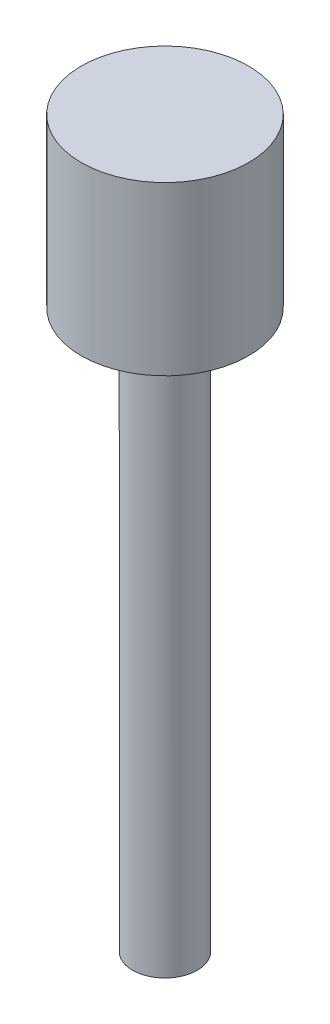
ISO-10303-21;
HEADER;
FILE_DESCRIPTION(('STEP AP214'),'2;1');
FILE_NAME('part.step','',(''),(''),'','','');
FILE_SCHEMA(('AUTOMOTIVE_DESIGN { 1 0 10303 214 1 1 1 1 }'));
ENDSEC;
DATA;
#1=APPLICATION_CONTEXT('core data for automotive mechanical design processes');
#2=APPLICATION_PROTOCOL_DEFINITION('international standard','automotive_design',2000,#1);
#3=PRODUCT_CONTEXT('',#1,'mechanical');
#4=PRODUCT('Part','Part','',(#3));
#5=PRODUCT_RELATED_PRODUCT_CATEGORY('part','',(#4));
#6=PRODUCT_DEFINITION_FORMATION('','',#4);
#7=PRODUCT_DEFINITION_CONTEXT('part definition',#1,'design');
#8=PRODUCT_DEFINITION('design','',#6,#7);
#9=PRODUCT_DEFINITION_SHAPE('','',#8);
#10=(LENGTH_UNIT() NAMED_UNIT(*) SI_UNIT(.MILLI.,.METRE.));
#11=(NAMED_UNIT(*) PLANE_ANGLE_UNIT() SI_UNIT($,.RADIAN.));
#12=(NAMED_UNIT(*) SI_UNIT($,.STERADIAN.) SOLID_ANGLE_UNIT());
#13=UNCERTAINTY_MEASURE_WITH_UNIT(LENGTH_MEASURE(1.E-05),#10,'distance_accuracy_value','');
#14=(GEOMETRIC_REPRESENTATION_CONTEXT(3) GLOBAL_UNCERTAINTY_ASSIGNED_CONTEXT((#13)) GLOBAL_UNIT_ASSIGNED_CONTEXT((#10,
#11,#12)) REPRESENTATION_CONTEXT('',''));
#15=CARTESIAN_POINT('',(0.,0.,0.));
#16=DIRECTION('',(0.,0.,1.));
#17=DIRECTION('',(1.,0.,0.));
#18=AXIS2_PLACEMENT_3D('',#15,#16,#17);
#19=CARTESIAN_POINT('',(0.,-65.,0.));
#20=DIRECTION('',(0.,-1.,0.));
#21=DIRECTION('',(0.,0.,-1.));
#22=AXIS2_PLACEMENT_3D('',#19,#20,#21);
#23=PLANE('',#22);
#24=CARTESIAN_POINT('',(0.,-65.,0.));
#25=DIRECTION('',(0.,-1.,0.));
#26=DIRECTION('',(0.,0.,-1.));
#27=AXIS2_PLACEMENT_3D('',#24,#25,#26);
#28=CIRCLE('',#27,2.9);
#29=CARTESIAN_POINT('',(0.,-65.,-2.9));
#30=VERTEX_POINT('',#29);
#31=EDGE_CURVE('E46',#30,#30,#28,.T.);
#32=ORIENTED_EDGE('',*,*,#31,.T.);
#33=EDGE_LOOP('',(#32));
#34=FACE_BOUND('',#33,.T.);
#35=CARTESIAN_POINT('',(0.,-65.,0.));
#36=DIRECTION('',(0.,1.,0.));
#37=DIRECTION('',(0.,0.,1.));
#38=AXIS2_PLACEMENT_3D('',#35,#36,#37);
#39=CIRCLE('',#38,1.65);
#40=CARTESIAN_POINT('',(0.,-65.,1.65));
#41=VERTEX_POINT('',#40);
#42=EDGE_CURVE('E51',#41,#41,#39,.T.);
#43=ORIENTED_EDGE('',*,*,#42,.T.);
#44=EDGE_LOOP('',(#43));
#45=FACE_BOUND('',#44,.T.);
#46=ADVANCED_FACE('F30',(#34,#45),#23,.T.);
#47=CARTESIAN_POINT('',(0.,-15.,0.));
#48=DIRECTION('',(0.,1.,0.));
#49=DIRECTION('',(0.,0.,1.));
#50=AXIS2_PLACEMENT_3D('',#47,#48,#49);
#51=PLANE('',#50);
#52=CARTESIAN_POINT('',(0.,-15.,0.));
#53=DIRECTION('',(0.,1.,0.));
#54=DIRECTION('',(0.,0.,1.));
#55=AXIS2_PLACEMENT_3D('',#52,#53,#54);
#56=CIRCLE('',#55,7.5);
#57=CARTESIAN_POINT('',(0.,-15.,7.5));
#58=VERTEX_POINT('',#57);
#59=EDGE_CURVE('E37',#58,#58,#56,.T.);
#60=ORIENTED_EDGE('',*,*,#59,.F.);
#61=EDGE_LOOP('',(#60));
#62=FACE_BOUND('',#61,.T.);
#63=CARTESIAN_POINT('',(0.,-15.,0.));
#64=DIRECTION('',(0.,1.,0.));
#65=DIRECTION('',(0.,0.,1.));
#66=AXIS2_PLACEMENT_3D('',#63,#64,#65);
#67=CIRCLE('',#66,2.9);
#68=CARTESIAN_POINT('',(0.,-15.,2.9));
#69=VERTEX_POINT('',#68);
#70=EDGE_CURVE('E10',#69,#69,#67,.F.);
#71=ORIENTED_EDGE('',*,*,#70,.F.);
#72=EDGE_LOOP('',(#71));
#73=FACE_BOUND('',#72,.T.);
#74=ADVANCED_FACE('F69',(#62,#73),#51,.F.);
#75=CARTESIAN_POINT('',(0.,-15.,0.));
#76=DIRECTION('',(0.,1.,0.));
#77=DIRECTION('',(0.,0.,1.));
#78=AXIS2_PLACEMENT_3D('',#75,#76,#77);
#79=CYLINDRICAL_SURFACE('',#78,7.5);
#80=ORIENTED_EDGE('',*,*,#59,.T.);
#81=EDGE_LOOP('',(#80));
#82=FACE_BOUND('',#81,.T.);
#83=CARTESIAN_POINT('',(0.,0.,0.));
#84=DIRECTION('',(0.,1.,0.));
#85=DIRECTION('',(0.,0.,1.));
#86=AXIS2_PLACEMENT_3D('',#83,#84,#85);
#87=CIRCLE('',#86,7.5);
#88=CARTESIAN_POINT('',(0.,0.,7.5));
#89=VERTEX_POINT('',#88);
#90=EDGE_CURVE('E41',#89,#89,#87,.T.);
#91=ORIENTED_EDGE('',*,*,#90,.F.);
#92=EDGE_LOOP('',(#91));
#93=FACE_BOUND('',#92,.T.);
#94=ADVANCED_FACE('F32',(#82,#93),#79,.T.);
#95=CARTESIAN_POINT('',(0.,0.,0.));
#96=DIRECTION('',(0.,1.,0.));
#97=DIRECTION('',(0.,0.,1.));
#98=AXIS2_PLACEMENT_3D('',#95,#96,#97);
#99=PLANE('',#98);
#100=ORIENTED_EDGE('',*,*,#90,.T.);
#101=EDGE_LOOP('',(#100));
#102=FACE_BOUND('',#101,.T.);
#103=ADVANCED_FACE('F80',(#102),#99,.T.);
#104=CARTESIAN_POINT('',(0.,-65.,0.));
#105=DIRECTION('',(0.,1.,0.));
#106=DIRECTION('',(0.,0.,1.));
#107=AXIS2_PLACEMENT_3D('',#104,#105,#106);
#108=CYLINDRICAL_SURFACE('',#107,2.9);
#109=ORIENTED_EDGE('',*,*,#31,.F.);
#110=EDGE_LOOP('',(#109));
#111=FACE_BOUND('',#110,.T.);
#112=ORIENTED_EDGE('',*,*,#70,.T.);
#113=EDGE_LOOP('',(#112));
#114=FACE_BOUND('',#113,.T.);
#115=ADVANCED_FACE('F66',(#111,#114),#108,.T.);
#116=CARTESIAN_POINT('',(0.,-53.,0.));
#117=DIRECTION('',(0.,-1.,0.));
#118=DIRECTION('',(0.,0.,-1.));
#119=AXIS2_PLACEMENT_3D('',#116,#117,#118);
#120=CYLINDRICAL_SURFACE('',#119,1.65);
#121=CARTESIAN_POINT('',(0.,-53.,0.));
#122=DIRECTION('',(0.,1.,0.));
#123=DIRECTION('',(0.,0.,1.));
#124=AXIS2_PLACEMENT_3D('',#121,#122,#123);
#125=CIRCLE('',#124,1.65);
#126=CARTESIAN_POINT('',(0.,-53.,1.65));
#127=VERTEX_POINT('',#126);
#128=EDGE_CURVE('E50',#127,#127,#125,.T.);
#129=ORIENTED_EDGE('',*,*,#128,.T.);
#130=EDGE_LOOP('',(#129));
#131=FACE_BOUND('',#130,.T.);
#132=ORIENTED_EDGE('',*,*,#42,.F.);
#133=EDGE_LOOP('',(#132));
#134=FACE_BOUND('',#133,.T.);
#135=ADVANCED_FACE('F57',(#131,#134),#120,.F.);
#136=CARTESIAN_POINT('',(0.,-53.,0.));
#137=DIRECTION('',(0.,1.,0.));
#138=DIRECTION('',(0.,0.,1.));
#139=AXIS2_PLACEMENT_3D('',#136,#137,#138);
#140=PLANE('',#139);
#141=ORIENTED_EDGE('',*,*,#128,.F.);
#142=EDGE_LOOP('',(#141));
#143=FACE_BOUND('',#142,.T.);
#144=ADVANCED_FACE('F60',(#143),#140,.F.);
#145=CLOSED_SHELL('',(#46,#74,#94,#103,#115,#135,#144));
#146=MANIFOLD_SOLID_BREP('B2',#145);
#147=ADVANCED_BREP_SHAPE_REPRESENTATION('',(#18,#146),#14);
#148=SHAPE_DEFINITION_REPRESENTATION(#9,#147);
ENDSEC;
END-ISO-10303-21;
